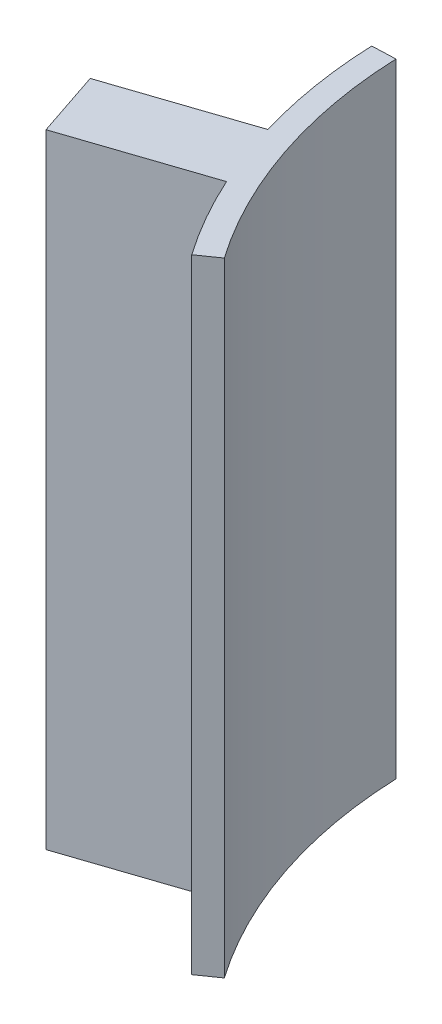
ISO-10303-21;
HEADER;
FILE_DESCRIPTION(('STEP AP214'),'2;1');
FILE_NAME('part.step','',(''),(''),'','','');
FILE_SCHEMA(('AUTOMOTIVE_DESIGN { 1 0 10303 214 1 1 1 1 }'));
ENDSEC;
DATA;
#1=APPLICATION_CONTEXT('core data for automotive mechanical design processes');
#2=APPLICATION_PROTOCOL_DEFINITION('international standard','automotive_design',2000,#1);
#3=PRODUCT_CONTEXT('',#1,'mechanical');
#4=PRODUCT('Part','Part','',(#3));
#5=PRODUCT_RELATED_PRODUCT_CATEGORY('part','',(#4));
#6=PRODUCT_DEFINITION_FORMATION('','',#4);
#7=PRODUCT_DEFINITION_CONTEXT('part definition',#1,'design');
#8=PRODUCT_DEFINITION('design','',#6,#7);
#9=PRODUCT_DEFINITION_SHAPE('','',#8);
#10=(LENGTH_UNIT() NAMED_UNIT(*) SI_UNIT(.MILLI.,.METRE.));
#11=(NAMED_UNIT(*) PLANE_ANGLE_UNIT() SI_UNIT($,.RADIAN.));
#12=(NAMED_UNIT(*) SI_UNIT($,.STERADIAN.) SOLID_ANGLE_UNIT());
#13=UNCERTAINTY_MEASURE_WITH_UNIT(LENGTH_MEASURE(1.E-05),#10,'distance_accuracy_value','');
#14=(GEOMETRIC_REPRESENTATION_CONTEXT(3) GLOBAL_UNCERTAINTY_ASSIGNED_CONTEXT((#13)) GLOBAL_UNIT_ASSIGNED_CONTEXT((#10,
#11,#12)) REPRESENTATION_CONTEXT('',''));
#15=CARTESIAN_POINT('',(0.,0.,0.));
#16=DIRECTION('',(0.,0.,1.));
#17=DIRECTION('',(1.,0.,0.));
#18=AXIS2_PLACEMENT_3D('',#15,#16,#17);
#19=CARTESIAN_POINT('',(2.10576385194429,80.,6.28143165208846));
#20=DIRECTION('',(-0.317851147463239,0.,-0.948140626730182));
#21=DIRECTION('',(-0.948140626730182,0.,0.317851147463239));
#22=AXIS2_PLACEMENT_3D('',#19,#20,#21);
#23=PLANE('',#22);
#24=DIRECTION('',(0.948140626730182,0.,-0.317851147463239));
#25=VECTOR('',#24,1.);
#26=CARTESIAN_POINT('',(2.10576385194429,0.,6.28143165208846));
#27=LINE('',#26,#25);
#28=CARTESIAN_POINT('',(-76.5487551518563,0.,32.6492809074729));
#29=VERTEX_POINT('',#28);
#30=CARTESIAN_POINT('',(-59.2024297639014,0.,26.8341631144019));
#31=VERTEX_POINT('',#30);
#32=EDGE_CURVE('E137',#29,#31,#27,.T.);
#33=ORIENTED_EDGE('',*,*,#32,.T.);
#34=DIRECTION('',(0.,-1.,0.));
#35=VECTOR('',#34,1.);
#36=CARTESIAN_POINT('',(-59.2024297639014,80.,26.8341631144019));
#37=LINE('',#36,#35);
#38=CARTESIAN_POINT('',(-59.2024297639014,80.,26.8341631144019));
#39=VERTEX_POINT('',#38);
#40=EDGE_CURVE('E11',#39,#31,#37,.T.);
#41=ORIENTED_EDGE('',*,*,#40,.F.);
#42=DIRECTION('',(0.948140626730182,0.,-0.317851147463239));
#43=VECTOR('',#42,1.);
#44=CARTESIAN_POINT('',(2.10576385194429,80.,6.28143165208846));
#45=LINE('',#44,#43);
#46=CARTESIAN_POINT('',(-76.5487551518563,80.,32.6492809074729));
#47=VERTEX_POINT('',#46);
#48=EDGE_CURVE('E155',#47,#39,#45,.T.);
#49=ORIENTED_EDGE('',*,*,#48,.F.);
#50=DIRECTION('',(0.,-1.,0.));
#51=VECTOR('',#50,1.);
#52=CARTESIAN_POINT('',(-76.5487551518563,80.,32.6492809074729));
#53=LINE('',#52,#51);
#54=EDGE_CURVE('E55',#47,#29,#53,.T.);
#55=ORIENTED_EDGE('',*,*,#54,.T.);
#56=EDGE_LOOP('',(#33,#41,#49,#55));
#57=FACE_BOUND('',#56,.T.);
#58=ADVANCED_FACE('F39',(#57),#23,.F.);
#59=CARTESIAN_POINT('',(0.,80.,0.));
#60=DIRECTION('',(0.,-1.,0.));
#61=DIRECTION('',(0.,0.,-1.));
#62=AXIS2_PLACEMENT_3D('',#59,#60,#61);
#63=CYLINDRICAL_SURFACE('',#62,65.);
#64=CARTESIAN_POINT('',(0.,0.,0.));
#65=DIRECTION('',(0.,1.,0.));
#66=DIRECTION('',(0.,0.,1.));
#67=AXIS2_PLACEMENT_3D('',#64,#65,#66);
#68=CIRCLE('',#67,65.);
#69=CARTESIAN_POINT('',(-53.3079109514694,0.,37.192292615409));
#70=VERTEX_POINT('',#69);
#71=EDGE_CURVE('E139',#31,#70,#68,.T.);
#72=ORIENTED_EDGE('',*,*,#71,.T.);
#73=DIRECTION('',(0.,-1.,0.));
#74=VECTOR('',#73,1.);
#75=CARTESIAN_POINT('',(-53.3079109514694,80.,37.192292615409));
#76=LINE('',#75,#74);
#77=CARTESIAN_POINT('',(-53.3079109514694,80.,37.192292615409));
#78=VERTEX_POINT('',#77);
#79=EDGE_CURVE('E47',#78,#70,#76,.T.);
#80=ORIENTED_EDGE('',*,*,#79,.F.);
#81=CARTESIAN_POINT('',(0.,80.,0.));
#82=DIRECTION('',(0.,1.,0.));
#83=DIRECTION('',(0.,0.,1.));
#84=AXIS2_PLACEMENT_3D('',#81,#82,#83);
#85=CIRCLE('',#84,65.);
#86=EDGE_CURVE('E93',#39,#78,#85,.T.);
#87=ORIENTED_EDGE('',*,*,#86,.F.);
#88=ORIENTED_EDGE('',*,*,#40,.T.);
#89=EDGE_LOOP('',(#72,#80,#87,#88));
#90=FACE_BOUND('',#89,.T.);
#91=ADVANCED_FACE('F182',(#90),#63,.T.);
#92=CARTESIAN_POINT('',(0.,80.,0.));
#93=DIRECTION('',(-0.572189117160138,0.,-0.820121706945684));
#94=DIRECTION('',(-0.820121706945684,0.,0.572189117160138));
#95=AXIS2_PLACEMENT_3D('',#92,#93,#94);
#96=PLANE('',#95);
#97=DIRECTION('',(0.820121706945684,0.,-0.572189117160138));
#98=VECTOR('',#97,1.);
#99=CARTESIAN_POINT('',(0.,0.,0.));
#100=LINE('',#99,#98);
#101=CARTESIAN_POINT('',(-50.8475458306324,0.,35.4757252639285));
#102=VERTEX_POINT('',#101);
#103=EDGE_CURVE('E141',#70,#102,#100,.T.);
#104=ORIENTED_EDGE('',*,*,#103,.T.);
#105=DIRECTION('',(0.,-1.,0.));
#106=VECTOR('',#105,1.);
#107=CARTESIAN_POINT('',(-50.8475458306324,80.,35.4757252639285));
#108=LINE('',#107,#106);
#109=CARTESIAN_POINT('',(-50.8475458306324,80.,35.4757252639285));
#110=VERTEX_POINT('',#109);
#111=EDGE_CURVE('E161',#110,#102,#108,.T.);
#112=ORIENTED_EDGE('',*,*,#111,.F.);
#113=DIRECTION('',(0.820121706945684,0.,-0.572189117160138));
#114=VECTOR('',#113,1.);
#115=CARTESIAN_POINT('',(0.,80.,0.));
#116=LINE('',#115,#114);
#117=EDGE_CURVE('E168',#78,#110,#116,.T.);
#118=ORIENTED_EDGE('',*,*,#117,.F.);
#119=ORIENTED_EDGE('',*,*,#79,.T.);
#120=EDGE_LOOP('',(#104,#112,#118,#119));
#121=FACE_BOUND('',#120,.T.);
#122=ADVANCED_FACE('F166',(#121),#96,.F.);
#123=CARTESIAN_POINT('',(0.,80.,0.));
#124=DIRECTION('',(0.,-1.,0.));
#125=DIRECTION('',(0.,0.,-1.));
#126=AXIS2_PLACEMENT_3D('',#123,#124,#125);
#127=CYLINDRICAL_SURFACE('',#126,62.);
#128=CARTESIAN_POINT('',(0.,0.,0.));
#129=DIRECTION('',(0.,1.,0.));
#130=DIRECTION('',(0.,0.,1.));
#131=AXIS2_PLACEMENT_3D('',#128,#129,#130);
#132=CIRCLE('',#131,62.);
#133=CARTESIAN_POINT('',(-61.9558240045633,0.,2.34005810089677));
#134=VERTEX_POINT('',#133);
#135=EDGE_CURVE('E144',#134,#102,#132,.T.);
#136=ORIENTED_EDGE('',*,*,#135,.F.);
#137=DIRECTION('',(0.,-1.,0.));
#138=VECTOR('',#137,1.);
#139=CARTESIAN_POINT('',(-61.9558240045633,80.,2.34005810089677));
#140=LINE('',#139,#138);
#141=CARTESIAN_POINT('',(-61.9558240045633,80.,2.34005810089677));
#142=VERTEX_POINT('',#141);
#143=EDGE_CURVE('E159',#142,#134,#140,.T.);
#144=ORIENTED_EDGE('',*,*,#143,.F.);
#145=CARTESIAN_POINT('',(0.,80.,0.));
#146=DIRECTION('',(0.,1.,0.));
#147=DIRECTION('',(0.,0.,1.));
#148=AXIS2_PLACEMENT_3D('',#145,#146,#147);
#149=CIRCLE('',#148,62.);
#150=EDGE_CURVE('E176',#142,#110,#149,.T.);
#151=ORIENTED_EDGE('',*,*,#150,.T.);
#152=ORIENTED_EDGE('',*,*,#111,.T.);
#153=EDGE_LOOP('',(#136,#144,#151,#152));
#154=FACE_BOUND('',#153,.T.);
#155=ADVANCED_FACE('F174',(#154),#127,.F.);
#156=CARTESIAN_POINT('',(0.,80.,0.));
#157=DIRECTION('',(0.0377428725951092,0.,0.99928748394457));
#158=DIRECTION('',(0.99928748394457,0.,-0.0377428725951092));
#159=AXIS2_PLACEMENT_3D('',#156,#157,#158);
#160=PLANE('',#159);
#161=DIRECTION('',(-0.99928748394457,0.,0.0377428725951092));
#162=VECTOR('',#161,1.);
#163=CARTESIAN_POINT('',(0.,0.,0.));
#164=LINE('',#163,#162);
#165=CARTESIAN_POINT('',(-64.9536864563971,0.,2.4532867186821));
#166=VERTEX_POINT('',#165);
#167=EDGE_CURVE('E147',#134,#166,#164,.T.);
#168=ORIENTED_EDGE('',*,*,#167,.T.);
#169=DIRECTION('',(0.,-1.,0.));
#170=VECTOR('',#169,1.);
#171=CARTESIAN_POINT('',(-64.9536864563971,80.,2.4532867186821));
#172=LINE('',#171,#170);
#173=CARTESIAN_POINT('',(-64.9536864563971,80.,2.4532867186821));
#174=VERTEX_POINT('',#173);
#175=EDGE_CURVE('E129',#174,#166,#172,.T.);
#176=ORIENTED_EDGE('',*,*,#175,.F.);
#177=DIRECTION('',(-0.99928748394457,0.,0.0377428725951092));
#178=VECTOR('',#177,1.);
#179=CARTESIAN_POINT('',(0.,80.,0.));
#180=LINE('',#179,#178);
#181=EDGE_CURVE('E117',#142,#174,#180,.T.);
#182=ORIENTED_EDGE('',*,*,#181,.F.);
#183=ORIENTED_EDGE('',*,*,#143,.T.);
#184=EDGE_LOOP('',(#168,#176,#182,#183));
#185=FACE_BOUND('',#184,.T.);
#186=ADVANCED_FACE('F192',(#185),#160,.F.);
#187=CARTESIAN_POINT('',(0.,80.,0.));
#188=DIRECTION('',(0.,-1.,0.));
#189=DIRECTION('',(0.,0.,-1.));
#190=AXIS2_PLACEMENT_3D('',#187,#188,#189);
#191=CYLINDRICAL_SURFACE('',#190,65.);
#192=CARTESIAN_POINT('',(0.,0.,0.));
#193=DIRECTION('',(0.,1.,0.));
#194=DIRECTION('',(0.,0.,1.));
#195=AXIS2_PLACEMENT_3D('',#192,#193,#194);
#196=CIRCLE('',#195,65.);
#197=CARTESIAN_POINT('',(-62.3428841978822,0.,18.394694612563));
#198=VERTEX_POINT('',#197);
#199=EDGE_CURVE('E126',#166,#198,#196,.T.);
#200=ORIENTED_EDGE('',*,*,#199,.T.);
#201=DIRECTION('',(0.,-1.,0.));
#202=VECTOR('',#201,1.);
#203=CARTESIAN_POINT('',(-62.3428841978822,80.,18.394694612563));
#204=LINE('',#203,#202);
#205=CARTESIAN_POINT('',(-62.3428841978822,80.,18.394694612563));
#206=VERTEX_POINT('',#205);
#207=EDGE_CURVE('E123',#206,#198,#204,.T.);
#208=ORIENTED_EDGE('',*,*,#207,.F.);
#209=CARTESIAN_POINT('',(0.,80.,0.));
#210=DIRECTION('',(0.,1.,0.));
#211=DIRECTION('',(0.,0.,1.));
#212=AXIS2_PLACEMENT_3D('',#209,#210,#211);
#213=CIRCLE('',#212,65.);
#214=EDGE_CURVE('E109',#174,#206,#213,.T.);
#215=ORIENTED_EDGE('',*,*,#214,.F.);
#216=ORIENTED_EDGE('',*,*,#175,.T.);
#217=EDGE_LOOP('',(#200,#208,#215,#216));
#218=FACE_BOUND('',#217,.T.);
#219=ADVANCED_FACE('F124',(#218),#191,.T.);
#220=CARTESIAN_POINT('',(-0.754896475224843,80.,-2.25183398848314));
#221=DIRECTION('',(-0.317851147463239,0.,-0.948140626730182));
#222=DIRECTION('',(-0.948140626730182,0.,0.317851147463239));
#223=AXIS2_PLACEMENT_3D('',#220,#221,#222);
#224=PLANE('',#223);
#225=DIRECTION('',(0.948140626730182,0.,-0.317851147463239));
#226=VECTOR('',#225,1.);
#227=CARTESIAN_POINT('',(-0.754896475224843,0.,-2.25183398848314));
#228=LINE('',#227,#226);
#229=CARTESIAN_POINT('',(-79.4094154790254,0.,24.1160152669012));
#230=VERTEX_POINT('',#229);
#231=EDGE_CURVE('E150',#230,#198,#228,.T.);
#232=ORIENTED_EDGE('',*,*,#231,.F.);
#233=DIRECTION('',(0.,-1.,0.));
#234=VECTOR('',#233,1.);
#235=CARTESIAN_POINT('',(-79.4094154790254,80.,24.1160152669012));
#236=LINE('',#235,#234);
#237=CARTESIAN_POINT('',(-79.4094154790254,80.,24.1160152669012));
#238=VERTEX_POINT('',#237);
#239=EDGE_CURVE('E81',#238,#230,#236,.T.);
#240=ORIENTED_EDGE('',*,*,#239,.F.);
#241=DIRECTION('',(0.948140626730182,0.,-0.317851147463239));
#242=VECTOR('',#241,1.);
#243=CARTESIAN_POINT('',(-0.754896475224843,80.,-2.25183398848314));
#244=LINE('',#243,#242);
#245=EDGE_CURVE('E114',#238,#206,#244,.T.);
#246=ORIENTED_EDGE('',*,*,#245,.T.);
#247=ORIENTED_EDGE('',*,*,#207,.T.);
#248=EDGE_LOOP('',(#232,#240,#246,#247));
#249=FACE_BOUND('',#248,.T.);
#250=ADVANCED_FACE('F131',(#249),#224,.T.);
#251=CARTESIAN_POINT('',(-78.6545190038006,80.,26.3678492553844));
#252=DIRECTION('',(-0.948140626730182,0.,0.317851147463239));
#253=DIRECTION('',(0.317851147463239,0.,0.948140626730182));
#254=AXIS2_PLACEMENT_3D('',#251,#252,#253);
#255=PLANE('',#254);
#256=DIRECTION('',(-0.317851147463239,0.,-0.948140626730182));
#257=VECTOR('',#256,1.);
#258=CARTESIAN_POINT('',(-78.6545190038006,0.,26.3678492553844));
#259=LINE('',#258,#257);
#260=EDGE_CURVE('E152',#29,#230,#259,.T.);
#261=ORIENTED_EDGE('',*,*,#260,.F.);
#262=ORIENTED_EDGE('',*,*,#54,.F.);
#263=DIRECTION('',(-0.317851147463239,0.,-0.948140626730182));
#264=VECTOR('',#263,1.);
#265=CARTESIAN_POINT('',(-78.6545190038006,80.,26.3678492553844));
#266=LINE('',#265,#264);
#267=EDGE_CURVE('E132',#47,#238,#266,.T.);
#268=ORIENTED_EDGE('',*,*,#267,.T.);
#269=ORIENTED_EDGE('',*,*,#239,.T.);
#270=EDGE_LOOP('',(#261,#262,#268,#269));
#271=FACE_BOUND('',#270,.T.);
#272=ADVANCED_FACE('F200',(#271),#255,.T.);
#273=CARTESIAN_POINT('',(0.,80.,0.));
#274=DIRECTION('',(0.,1.,0.));
#275=DIRECTION('',(0.,0.,1.));
#276=AXIS2_PLACEMENT_3D('',#273,#274,#275);
#277=PLANE('',#276);
#278=ORIENTED_EDGE('',*,*,#48,.T.);
#279=ORIENTED_EDGE('',*,*,#86,.T.);
#280=ORIENTED_EDGE('',*,*,#117,.T.);
#281=ORIENTED_EDGE('',*,*,#150,.F.);
#282=ORIENTED_EDGE('',*,*,#181,.T.);
#283=ORIENTED_EDGE('',*,*,#214,.T.);
#284=ORIENTED_EDGE('',*,*,#245,.F.);
#285=ORIENTED_EDGE('',*,*,#267,.F.);
#286=EDGE_LOOP('',(#278,#279,#280,#281,#282,#283,#284,#285));
#287=FACE_BOUND('',#286,.T.);
#288=ADVANCED_FACE('F111',(#287),#277,.T.);
#289=CARTESIAN_POINT('',(0.,0.,0.));
#290=DIRECTION('',(0.,1.,0.));
#291=DIRECTION('',(0.,0.,1.));
#292=AXIS2_PLACEMENT_3D('',#289,#290,#291);
#293=PLANE('',#292);
#294=ORIENTED_EDGE('',*,*,#32,.F.);
#295=ORIENTED_EDGE('',*,*,#260,.T.);
#296=ORIENTED_EDGE('',*,*,#231,.T.);
#297=ORIENTED_EDGE('',*,*,#199,.F.);
#298=ORIENTED_EDGE('',*,*,#167,.F.);
#299=ORIENTED_EDGE('',*,*,#135,.T.);
#300=ORIENTED_EDGE('',*,*,#103,.F.);
#301=ORIENTED_EDGE('',*,*,#71,.F.);
#302=EDGE_LOOP('',(#294,#295,#296,#297,#298,#299,#300,#301));
#303=FACE_BOUND('',#302,.T.);
#304=ADVANCED_FACE('F170',(#303),#293,.F.);
#305=CLOSED_SHELL('',(#58,#91,#122,#155,#186,#219,#250,#272,#288,#304));
#306=MANIFOLD_SOLID_BREP('B2',#305);
#307=ADVANCED_BREP_SHAPE_REPRESENTATION('',(#18,#306),#14);
#308=SHAPE_DEFINITION_REPRESENTATION(#9,#307);
ENDSEC;
END-ISO-10303-21;
